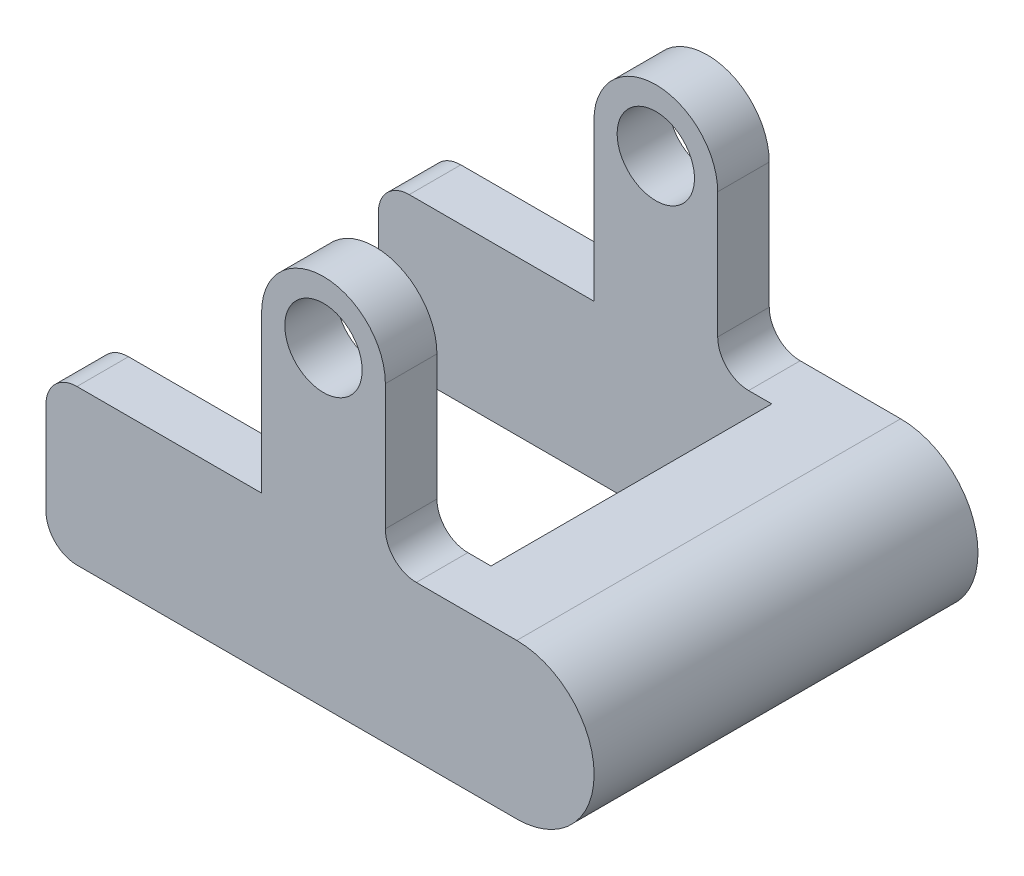
ISO-10303-21;
HEADER;
FILE_DESCRIPTION(('STEP AP214'),'2;1');
FILE_NAME('part.step','',(''),(''),'','','');
FILE_SCHEMA(('AUTOMOTIVE_DESIGN { 1 0 10303 214 1 1 1 1 }'));
ENDSEC;
DATA;
#1=APPLICATION_CONTEXT('core data for automotive mechanical design processes');
#2=APPLICATION_PROTOCOL_DEFINITION('international standard','automotive_design',2000,#1);
#3=PRODUCT_CONTEXT('',#1,'mechanical');
#4=PRODUCT('Part','Part','',(#3));
#5=PRODUCT_RELATED_PRODUCT_CATEGORY('part','',(#4));
#6=PRODUCT_DEFINITION_FORMATION('','',#4);
#7=PRODUCT_DEFINITION_CONTEXT('part definition',#1,'design');
#8=PRODUCT_DEFINITION('design','',#6,#7);
#9=PRODUCT_DEFINITION_SHAPE('','',#8);
#10=(LENGTH_UNIT() NAMED_UNIT(*) SI_UNIT(.MILLI.,.METRE.));
#11=(NAMED_UNIT(*) PLANE_ANGLE_UNIT() SI_UNIT($,.RADIAN.));
#12=(NAMED_UNIT(*) SI_UNIT($,.STERADIAN.) SOLID_ANGLE_UNIT());
#13=UNCERTAINTY_MEASURE_WITH_UNIT(LENGTH_MEASURE(1.E-05),#10,'distance_accuracy_value','');
#14=(GEOMETRIC_REPRESENTATION_CONTEXT(3) GLOBAL_UNCERTAINTY_ASSIGNED_CONTEXT((#13)) GLOBAL_UNIT_ASSIGNED_CONTEXT((#10,
#11,#12)) REPRESENTATION_CONTEXT('',''));
#15=CARTESIAN_POINT('',(0.,0.,0.));
#16=DIRECTION('',(0.,0.,1.));
#17=DIRECTION('',(1.,0.,0.));
#18=AXIS2_PLACEMENT_3D('',#15,#16,#17);
#19=CARTESIAN_POINT('',(-862.5,217.305377859386,25.));
#20=DIRECTION('',(0.,0.,-1.));
#21=DIRECTION('',(-1.,0.,0.));
#22=AXIS2_PLACEMENT_3D('',#19,#20,#21);
#23=CYLINDRICAL_SURFACE('',#22,37.5);
#24=DIRECTION('',(0.,0.,-1.));
#25=VECTOR('',#24,1.);
#26=CARTESIAN_POINT('',(-862.5,254.805377859386,25.));
#27=LINE('',#26,#25);
#28=CARTESIAN_POINT('',(-862.5,254.805377859386,25.));
#29=VERTEX_POINT('',#28);
#30=CARTESIAN_POINT('',(-862.5,254.805377859386,-161.125));
#31=VERTEX_POINT('',#30);
#32=EDGE_CURVE('E284',#29,#31,#27,.T.);
#33=ORIENTED_EDGE('',*,*,#32,.F.);
#34=CARTESIAN_POINT('',(-862.5,217.305377859386,25.));
#35=DIRECTION('',(0.,0.,1.));
#36=DIRECTION('',(1.,0.,0.));
#37=AXIS2_PLACEMENT_3D('',#34,#35,#36);
#38=CIRCLE('',#37,37.5);
#39=CARTESIAN_POINT('',(-862.5,179.805377859386,25.));
#40=VERTEX_POINT('',#39);
#41=EDGE_CURVE('E290',#40,#29,#38,.T.);
#42=ORIENTED_EDGE('',*,*,#41,.F.);
#43=DIRECTION('',(0.,0.,-1.));
#44=VECTOR('',#43,1.);
#45=CARTESIAN_POINT('',(-862.5,179.805377859386,25.));
#46=LINE('',#45,#44);
#47=CARTESIAN_POINT('',(-862.5,179.805377859386,-161.125));
#48=VERTEX_POINT('',#47);
#49=EDGE_CURVE('E287',#48,#40,#46,.F.);
#50=ORIENTED_EDGE('',*,*,#49,.F.);
#51=CARTESIAN_POINT('',(-862.5,217.305377859386,-161.125));
#52=DIRECTION('',(0.,0.,-1.));
#53=DIRECTION('',(-1.,0.,0.));
#54=AXIS2_PLACEMENT_3D('',#51,#52,#53);
#55=CIRCLE('',#54,37.5);
#56=EDGE_CURVE('E293',#31,#48,#55,.T.);
#57=ORIENTED_EDGE('',*,*,#56,.F.);
#58=EDGE_LOOP('',(#33,#42,#50,#57));
#59=FACE_BOUND('',#58,.T.);
#60=ADVANCED_FACE('F36',(#59),#23,.T.);
#61=CARTESIAN_POINT('',(-926.212499999999,0.,25.));
#62=DIRECTION('',(1.,0.,0.));
#63=DIRECTION('',(0.,0.,-1.));
#64=AXIS2_PLACEMENT_3D('',#61,#62,#63);
#65=PLANE('',#64);
#66=DIRECTION('',(0.,-1.,0.));
#67=VECTOR('',#66,1.);
#68=CARTESIAN_POINT('',(-926.212499999999,0.,25.));
#69=LINE('',#68,#67);
#70=CARTESIAN_POINT('',(-926.212499999999,330.750000000002,25.));
#71=VERTEX_POINT('',#70);
#72=CARTESIAN_POINT('',(-926.212499999999,269.805377859386,25.));
#73=VERTEX_POINT('',#72);
#74=EDGE_CURVE('E237',#71,#73,#69,.T.);
#75=ORIENTED_EDGE('',*,*,#74,.T.);
#76=DIRECTION('',(0.,0.,-1.));
#77=VECTOR('',#76,1.);
#78=CARTESIAN_POINT('',(-926.212499999999,269.805377859386,0.));
#79=LINE('',#78,#77);
#80=CARTESIAN_POINT('',(-926.212499999999,269.805377859386,0.));
#81=VERTEX_POINT('',#80);
#82=EDGE_CURVE('E336',#73,#81,#79,.T.);
#83=ORIENTED_EDGE('',*,*,#82,.T.);
#84=DIRECTION('',(0.,-1.,0.));
#85=VECTOR('',#84,1.);
#86=CARTESIAN_POINT('',(-926.212499999999,0.,0.));
#87=LINE('',#86,#85);
#88=CARTESIAN_POINT('',(-926.212499999999,330.750000000002,0.));
#89=VERTEX_POINT('',#88);
#90=EDGE_CURVE('E259',#89,#81,#87,.T.);
#91=ORIENTED_EDGE('',*,*,#90,.F.);
#92=DIRECTION('',(0.,0.,-1.));
#93=VECTOR('',#92,1.);
#94=CARTESIAN_POINT('',(-926.212499999999,330.750000000002,25.));
#95=LINE('',#94,#93);
#96=EDGE_CURVE('E282',#71,#89,#95,.T.);
#97=ORIENTED_EDGE('',*,*,#96,.F.);
#98=EDGE_LOOP('',(#75,#83,#91,#97));
#99=FACE_BOUND('',#98,.T.);
#100=ADVANCED_FACE('F356',(#99),#65,.T.);
#101=CARTESIAN_POINT('',(-956.212499999999,330.750000000002,25.));
#102=DIRECTION('',(0.,0.,-1.));
#103=DIRECTION('',(-1.,0.,0.));
#104=AXIS2_PLACEMENT_3D('',#101,#102,#103);
#105=CYLINDRICAL_SURFACE('',#104,30.0000000000006);
#106=CARTESIAN_POINT('',(-956.212499999999,330.750000000002,0.));
#107=DIRECTION('',(0.,0.,1.));
#108=DIRECTION('',(1.,0.,0.));
#109=AXIS2_PLACEMENT_3D('',#106,#107,#108);
#110=CIRCLE('',#109,30.0000000000006);
#111=CARTESIAN_POINT('',(-986.2125,330.750000000002,0.));
#112=VERTEX_POINT('',#111);
#113=EDGE_CURVE('E262',#89,#112,#110,.T.);
#114=ORIENTED_EDGE('',*,*,#113,.T.);
#115=DIRECTION('',(0.,0.,-1.));
#116=VECTOR('',#115,1.);
#117=CARTESIAN_POINT('',(-986.2125,330.750000000002,25.));
#118=LINE('',#117,#116);
#119=CARTESIAN_POINT('',(-986.2125,330.750000000002,25.));
#120=VERTEX_POINT('',#119);
#121=EDGE_CURVE('E279',#120,#112,#118,.T.);
#122=ORIENTED_EDGE('',*,*,#121,.F.);
#123=CARTESIAN_POINT('',(-956.212499999999,330.750000000002,25.));
#124=DIRECTION('',(0.,0.,1.));
#125=DIRECTION('',(1.,0.,0.));
#126=AXIS2_PLACEMENT_3D('',#123,#124,#125);
#127=CIRCLE('',#126,30.0000000000006);
#128=EDGE_CURVE('E240',#71,#120,#127,.T.);
#129=ORIENTED_EDGE('',*,*,#128,.F.);
#130=ORIENTED_EDGE('',*,*,#96,.T.);
#131=EDGE_LOOP('',(#114,#122,#129,#130));
#132=FACE_BOUND('',#131,.T.);
#133=ADVANCED_FACE('F363',(#132),#105,.T.);
#134=CARTESIAN_POINT('',(-986.2125,0.,25.));
#135=DIRECTION('',(1.,0.,0.));
#136=DIRECTION('',(0.,0.,-1.));
#137=AXIS2_PLACEMENT_3D('',#134,#135,#136);
#138=PLANE('',#137);
#139=DIRECTION('',(0.,-1.,0.));
#140=VECTOR('',#139,1.);
#141=CARTESIAN_POINT('',(-986.2125,0.,0.));
#142=LINE('',#141,#140);
#143=CARTESIAN_POINT('',(-986.2125,254.805377859386,0.));
#144=VERTEX_POINT('',#143);
#145=EDGE_CURVE('E265',#112,#144,#142,.T.);
#146=ORIENTED_EDGE('',*,*,#145,.T.);
#147=DIRECTION('',(0.,0.,-1.));
#148=VECTOR('',#147,1.);
#149=CARTESIAN_POINT('',(-986.2125,254.805377859386,25.));
#150=LINE('',#149,#148);
#151=CARTESIAN_POINT('',(-986.2125,254.805377859386,25.));
#152=VERTEX_POINT('',#151);
#153=EDGE_CURVE('E256',#152,#144,#150,.T.);
#154=ORIENTED_EDGE('',*,*,#153,.F.);
#155=DIRECTION('',(0.,-1.,0.));
#156=VECTOR('',#155,1.);
#157=CARTESIAN_POINT('',(-986.2125,0.,25.));
#158=LINE('',#157,#156);
#159=EDGE_CURVE('E243',#120,#152,#158,.T.);
#160=ORIENTED_EDGE('',*,*,#159,.F.);
#161=ORIENTED_EDGE('',*,*,#121,.T.);
#162=EDGE_LOOP('',(#146,#154,#160,#161));
#163=FACE_BOUND('',#162,.T.);
#164=ADVANCED_FACE('F365',(#163),#138,.F.);
#165=CARTESIAN_POINT('',(-1.35305893721298E-13,254.805377859387,25.));
#166=DIRECTION('',(0.,-1.,0.));
#167=DIRECTION('',(1.,0.,0.));
#168=AXIS2_PLACEMENT_3D('',#165,#166,#167);
#169=PLANE('',#168);
#170=DIRECTION('',(-1.,0.,0.));
#171=VECTOR('',#170,1.);
#172=CARTESIAN_POINT('',(-1.35305893721298E-13,254.805377859387,0.));
#173=LINE('',#172,#171);
#174=CARTESIAN_POINT('',(-1075.75,254.805377859386,0.));
#175=VERTEX_POINT('',#174);
#176=EDGE_CURVE('E268',#144,#175,#173,.T.);
#177=ORIENTED_EDGE('',*,*,#176,.T.);
#178=DIRECTION('',(0.,0.,-1.));
#179=VECTOR('',#178,1.);
#180=CARTESIAN_POINT('',(-1075.75,254.805377859386,25.));
#181=LINE('',#180,#179);
#182=CARTESIAN_POINT('',(-1075.75,254.805377859386,25.));
#183=VERTEX_POINT('',#182);
#184=EDGE_CURVE('E51',#175,#183,#181,.F.);
#185=ORIENTED_EDGE('',*,*,#184,.T.);
#186=DIRECTION('',(-1.,0.,0.));
#187=VECTOR('',#186,1.);
#188=CARTESIAN_POINT('',(-1.35305893721298E-13,254.805377859387,25.));
#189=LINE('',#188,#187);
#190=EDGE_CURVE('E246',#152,#183,#189,.T.);
#191=ORIENTED_EDGE('',*,*,#190,.F.);
#192=ORIENTED_EDGE('',*,*,#153,.T.);
#193=EDGE_LOOP('',(#177,#185,#191,#192));
#194=FACE_BOUND('',#193,.T.);
#195=ADVANCED_FACE('F366',(#194),#169,.F.);
#196=CARTESIAN_POINT('',(-1090.75,3.22926870429304E-12,25.));
#197=DIRECTION('',(-1.,0.,0.));
#198=DIRECTION('',(0.,-1.,0.));
#199=AXIS2_PLACEMENT_3D('',#196,#197,#198);
#200=PLANE('',#199);
#201=DIRECTION('',(0.,1.,0.));
#202=VECTOR('',#201,1.);
#203=CARTESIAN_POINT('',(-1090.75,3.22926870429304E-12,0.));
#204=LINE('',#203,#202);
#205=CARTESIAN_POINT('',(-1090.75,194.805377859386,0.));
#206=VERTEX_POINT('',#205);
#207=CARTESIAN_POINT('',(-1090.75,239.805377859386,0.));
#208=VERTEX_POINT('',#207);
#209=EDGE_CURVE('E270',#206,#208,#204,.T.);
#210=ORIENTED_EDGE('',*,*,#209,.F.);
#211=DIRECTION('',(0.,0.,-1.));
#212=VECTOR('',#211,1.);
#213=CARTESIAN_POINT('',(-1090.75,194.805377859386,25.));
#214=LINE('',#213,#212);
#215=CARTESIAN_POINT('',(-1090.75,194.805377859386,25.));
#216=VERTEX_POINT('',#215);
#217=EDGE_CURVE('E323',#206,#216,#214,.F.);
#218=ORIENTED_EDGE('',*,*,#217,.T.);
#219=DIRECTION('',(0.,1.,0.));
#220=VECTOR('',#219,1.);
#221=CARTESIAN_POINT('',(-1090.75,3.22926870429304E-12,25.));
#222=LINE('',#221,#220);
#223=CARTESIAN_POINT('',(-1090.75,239.805377859386,25.));
#224=VERTEX_POINT('',#223);
#225=EDGE_CURVE('E248',#216,#224,#222,.T.);
#226=ORIENTED_EDGE('',*,*,#225,.T.);
#227=DIRECTION('',(0.,0.,-1.));
#228=VECTOR('',#227,1.);
#229=CARTESIAN_POINT('',(-1090.75,239.805377859386,0.));
#230=LINE('',#229,#228);
#231=EDGE_CURVE('E320',#224,#208,#230,.T.);
#232=ORIENTED_EDGE('',*,*,#231,.T.);
#233=EDGE_LOOP('',(#210,#218,#226,#232));
#234=FACE_BOUND('',#233,.T.);
#235=ADVANCED_FACE('F373',(#234),#200,.T.);
#236=CARTESIAN_POINT('',(0.,179.805377859386,25.));
#237=DIRECTION('',(0.,-1.,0.));
#238=DIRECTION('',(0.,0.,-1.));
#239=AXIS2_PLACEMENT_3D('',#236,#237,#238);
#240=PLANE('',#239);
#241=DIRECTION('',(-1.,0.,0.));
#242=VECTOR('',#241,1.);
#243=CARTESIAN_POINT('',(-825.,179.805377859386,-136.125));
#244=LINE('',#243,#242);
#245=CARTESIAN_POINT('',(-900.,179.805377859386,-136.125));
#246=VERTEX_POINT('',#245);
#247=CARTESIAN_POINT('',(-1075.75,179.805377859386,-136.125));
#248=VERTEX_POINT('',#247);
#249=EDGE_CURVE('E403',#246,#248,#244,.T.);
#250=ORIENTED_EDGE('',*,*,#249,.T.);
#251=DIRECTION('',(0.,0.,1.));
#252=VECTOR('',#251,1.);
#253=CARTESIAN_POINT('',(-1075.75,179.805377859386,-161.125));
#254=LINE('',#253,#252);
#255=CARTESIAN_POINT('',(-1075.75,179.805377859386,-161.125));
#256=VERTEX_POINT('',#255);
#257=EDGE_CURVE('E314',#248,#256,#254,.F.);
#258=ORIENTED_EDGE('',*,*,#257,.T.);
#259=DIRECTION('',(-1.,0.,0.));
#260=VECTOR('',#259,1.);
#261=CARTESIAN_POINT('',(-825.,179.805377859386,-161.125));
#262=LINE('',#261,#260);
#263=EDGE_CURVE('E391',#48,#256,#262,.T.);
#264=ORIENTED_EDGE('',*,*,#263,.F.);
#265=ORIENTED_EDGE('',*,*,#49,.T.);
#266=DIRECTION('',(-1.,0.,0.));
#267=VECTOR('',#266,1.);
#268=CARTESIAN_POINT('',(0.,179.805377859386,25.));
#269=LINE('',#268,#267);
#270=CARTESIAN_POINT('',(-1075.75,179.805377859386,25.));
#271=VERTEX_POINT('',#270);
#272=EDGE_CURVE('E251',#40,#271,#269,.T.);
#273=ORIENTED_EDGE('',*,*,#272,.T.);
#274=DIRECTION('',(0.,0.,-1.));
#275=VECTOR('',#274,1.);
#276=CARTESIAN_POINT('',(-1075.75,179.805377859386,25.));
#277=LINE('',#276,#275);
#278=CARTESIAN_POINT('',(-1075.75,179.805377859386,0.));
#279=VERTEX_POINT('',#278);
#280=EDGE_CURVE('E311',#271,#279,#277,.T.);
#281=ORIENTED_EDGE('',*,*,#280,.T.);
#282=DIRECTION('',(-1.,0.,0.));
#283=VECTOR('',#282,1.);
#284=CARTESIAN_POINT('',(0.,179.805377859386,0.));
#285=LINE('',#284,#283);
#286=CARTESIAN_POINT('',(-900.,179.805377859386,0.));
#287=VERTEX_POINT('',#286);
#288=EDGE_CURVE('E273',#287,#279,#285,.T.);
#289=ORIENTED_EDGE('',*,*,#288,.F.);
#290=DIRECTION('',(0.,0.,-1.));
#291=VECTOR('',#290,1.);
#292=CARTESIAN_POINT('',(-900.,179.805377859386,106.066017177982));
#293=LINE('',#292,#291);
#294=EDGE_CURVE('E227',#287,#246,#293,.T.);
#295=ORIENTED_EDGE('',*,*,#294,.T.);
#296=EDGE_LOOP('',(#250,#258,#264,#265,#273,#281,#289,#295));
#297=FACE_BOUND('',#296,.T.);
#298=ADVANCED_FACE('F382',(#297),#240,.T.);
#299=CARTESIAN_POINT('',(-956.212499999999,330.750000000002,25.));
#300=DIRECTION('',(0.,0.,-1.));
#301=DIRECTION('',(-1.,0.,0.));
#302=AXIS2_PLACEMENT_3D('',#299,#300,#301);
#303=CYLINDRICAL_SURFACE('',#302,18.7499999999999);
#304=CARTESIAN_POINT('',(-956.212499999999,330.750000000002,25.));
#305=DIRECTION('',(0.,0.,1.));
#306=DIRECTION('',(1.,0.,0.));
#307=AXIS2_PLACEMENT_3D('',#304,#305,#306);
#308=CIRCLE('',#307,18.7499999999999);
#309=CARTESIAN_POINT('',(-937.4625,330.750000000002,25.));
#310=VERTEX_POINT('',#309);
#311=EDGE_CURVE('E234',#310,#310,#308,.T.);
#312=ORIENTED_EDGE('',*,*,#311,.T.);
#313=EDGE_LOOP('',(#312));
#314=FACE_BOUND('',#313,.T.);
#315=CARTESIAN_POINT('',(-956.212499999999,330.750000000002,0.));
#316=DIRECTION('',(0.,0.,1.));
#317=DIRECTION('',(1.,0.,0.));
#318=AXIS2_PLACEMENT_3D('',#315,#316,#317);
#319=CIRCLE('',#318,18.7499999999999);
#320=CARTESIAN_POINT('',(-937.4625,330.750000000002,0.));
#321=VERTEX_POINT('',#320);
#322=EDGE_CURVE('E230',#321,#321,#319,.T.);
#323=ORIENTED_EDGE('',*,*,#322,.F.);
#324=EDGE_LOOP('',(#323));
#325=FACE_BOUND('',#324,.T.);
#326=ADVANCED_FACE('F452',(#314,#325),#303,.F.);
#327=CARTESIAN_POINT('',(0.,254.805377859386,25.));
#328=DIRECTION('',(0.,1.,0.));
#329=DIRECTION('',(0.,0.,1.));
#330=AXIS2_PLACEMENT_3D('',#327,#328,#329);
#331=PLANE('',#330);
#332=DIRECTION('',(1.,0.,0.));
#333=VECTOR('',#332,1.);
#334=CARTESIAN_POINT('',(-926.212499999999,254.805377859386,-161.125));
#335=LINE('',#334,#333);
#336=CARTESIAN_POINT('',(-911.212499999999,254.805377859386,-161.125));
#337=VERTEX_POINT('',#336);
#338=EDGE_CURVE('E197',#337,#31,#335,.T.);
#339=ORIENTED_EDGE('',*,*,#338,.F.);
#340=DIRECTION('',(0.,0.,1.));
#341=VECTOR('',#340,1.);
#342=CARTESIAN_POINT('',(-911.212499999999,254.805377859386,25.));
#343=LINE('',#342,#341);
#344=CARTESIAN_POINT('',(-911.212499999999,254.805377859386,-136.125));
#345=VERTEX_POINT('',#344);
#346=EDGE_CURVE('E332',#337,#345,#343,.T.);
#347=ORIENTED_EDGE('',*,*,#346,.T.);
#348=DIRECTION('',(1.,0.,0.));
#349=VECTOR('',#348,1.);
#350=CARTESIAN_POINT('',(-926.212499999999,254.805377859386,-136.125));
#351=LINE('',#350,#349);
#352=CARTESIAN_POINT('',(-900.,254.805377859386,-136.125));
#353=VERTEX_POINT('',#352);
#354=EDGE_CURVE('E401',#345,#353,#351,.T.);
#355=ORIENTED_EDGE('',*,*,#354,.T.);
#356=DIRECTION('',(0.,0.,-1.));
#357=VECTOR('',#356,1.);
#358=CARTESIAN_POINT('',(-900.,254.805377859386,106.066017177982));
#359=LINE('',#358,#357);
#360=CARTESIAN_POINT('',(-900.,254.805377859386,0.));
#361=VERTEX_POINT('',#360);
#362=EDGE_CURVE('E214',#361,#353,#359,.T.);
#363=ORIENTED_EDGE('',*,*,#362,.F.);
#364=DIRECTION('',(1.,0.,0.));
#365=VECTOR('',#364,1.);
#366=CARTESIAN_POINT('',(0.,254.805377859386,0.));
#367=LINE('',#366,#365);
#368=CARTESIAN_POINT('',(-911.212499999999,254.805377859386,0.));
#369=VERTEX_POINT('',#368);
#370=EDGE_CURVE('E238',#369,#361,#367,.T.);
#371=ORIENTED_EDGE('',*,*,#370,.F.);
#372=DIRECTION('',(0.,0.,-1.));
#373=VECTOR('',#372,1.);
#374=CARTESIAN_POINT('',(-911.212499999999,254.805377859386,25.));
#375=LINE('',#374,#373);
#376=CARTESIAN_POINT('',(-911.212499999999,254.805377859386,25.));
#377=VERTEX_POINT('',#376);
#378=EDGE_CURVE('E330',#369,#377,#375,.F.);
#379=ORIENTED_EDGE('',*,*,#378,.T.);
#380=DIRECTION('',(1.,0.,0.));
#381=VECTOR('',#380,1.);
#382=CARTESIAN_POINT('',(0.,254.805377859386,25.));
#383=LINE('',#382,#381);
#384=EDGE_CURVE('E254',#377,#29,#383,.T.);
#385=ORIENTED_EDGE('',*,*,#384,.T.);
#386=ORIENTED_EDGE('',*,*,#32,.T.);
#387=EDGE_LOOP('',(#339,#347,#355,#363,#371,#379,#385,#386));
#388=FACE_BOUND('',#387,.T.);
#389=ADVANCED_FACE('F354',(#388),#331,.T.);
#390=CARTESIAN_POINT('',(0.,0.,25.));
#391=DIRECTION('',(0.,0.,1.));
#392=DIRECTION('',(1.,0.,0.));
#393=AXIS2_PLACEMENT_3D('',#390,#391,#392);
#394=PLANE('',#393);
#395=ORIENTED_EDGE('',*,*,#311,.F.);
#396=EDGE_LOOP('',(#395));
#397=FACE_BOUND('',#396,.T.);
#398=ORIENTED_EDGE('',*,*,#225,.F.);
#399=CARTESIAN_POINT('',(-1075.75,194.805377859386,25.));
#400=DIRECTION('',(0.,0.,1.));
#401=DIRECTION('',(1.,0.,0.));
#402=AXIS2_PLACEMENT_3D('',#399,#400,#401);
#403=CIRCLE('',#402,15.);
#404=EDGE_CURVE('E327',#216,#271,#403,.T.);
#405=ORIENTED_EDGE('',*,*,#404,.T.);
#406=ORIENTED_EDGE('',*,*,#272,.F.);
#407=ORIENTED_EDGE('',*,*,#41,.T.);
#408=ORIENTED_EDGE('',*,*,#384,.F.);
#409=CARTESIAN_POINT('',(-911.212499999999,269.805377859386,25.));
#410=DIRECTION('',(0.,0.,1.));
#411=DIRECTION('',(1.,0.,0.));
#412=AXIS2_PLACEMENT_3D('',#409,#410,#411);
#413=CIRCLE('',#412,15.);
#414=EDGE_CURVE('E11',#377,#73,#413,.F.);
#415=ORIENTED_EDGE('',*,*,#414,.T.);
#416=ORIENTED_EDGE('',*,*,#74,.F.);
#417=ORIENTED_EDGE('',*,*,#128,.T.);
#418=ORIENTED_EDGE('',*,*,#159,.T.);
#419=ORIENTED_EDGE('',*,*,#190,.T.);
#420=CARTESIAN_POINT('',(-1075.75,239.805377859386,25.));
#421=DIRECTION('',(0.,0.,1.));
#422=DIRECTION('',(1.,0.,0.));
#423=AXIS2_PLACEMENT_3D('',#420,#421,#422);
#424=CIRCLE('',#423,15.);
#425=EDGE_CURVE('E325',#183,#224,#424,.T.);
#426=ORIENTED_EDGE('',*,*,#425,.T.);
#427=EDGE_LOOP('',(#398,#405,#406,#407,#408,#415,#416,#417,#418,#419,#426));
#428=FACE_BOUND('',#427,.T.);
#429=ADVANCED_FACE('F359',(#397,#428),#394,.T.);
#430=CARTESIAN_POINT('',(0.,0.,0.));
#431=DIRECTION('',(0.,0.,1.));
#432=DIRECTION('',(1.,0.,0.));
#433=AXIS2_PLACEMENT_3D('',#430,#431,#432);
#434=PLANE('',#433);
#435=ORIENTED_EDGE('',*,*,#322,.T.);
#436=EDGE_LOOP('',(#435));
#437=FACE_BOUND('',#436,.T.);
#438=ORIENTED_EDGE('',*,*,#288,.T.);
#439=CARTESIAN_POINT('',(-1075.75,194.805377859386,0.));
#440=DIRECTION('',(0.,0.,1.));
#441=DIRECTION('',(1.,0.,0.));
#442=AXIS2_PLACEMENT_3D('',#439,#440,#441);
#443=CIRCLE('',#442,15.);
#444=EDGE_CURVE('E318',#279,#206,#443,.F.);
#445=ORIENTED_EDGE('',*,*,#444,.T.);
#446=ORIENTED_EDGE('',*,*,#209,.T.);
#447=CARTESIAN_POINT('',(-1075.75,239.805377859386,0.));
#448=DIRECTION('',(0.,0.,1.));
#449=DIRECTION('',(1.,0.,0.));
#450=AXIS2_PLACEMENT_3D('',#447,#448,#449);
#451=CIRCLE('',#450,15.);
#452=EDGE_CURVE('E316',#208,#175,#451,.F.);
#453=ORIENTED_EDGE('',*,*,#452,.T.);
#454=ORIENTED_EDGE('',*,*,#176,.F.);
#455=ORIENTED_EDGE('',*,*,#145,.F.);
#456=ORIENTED_EDGE('',*,*,#113,.F.);
#457=ORIENTED_EDGE('',*,*,#90,.T.);
#458=CARTESIAN_POINT('',(-911.212499999999,269.805377859386,0.));
#459=DIRECTION('',(0.,0.,1.));
#460=DIRECTION('',(1.,0.,0.));
#461=AXIS2_PLACEMENT_3D('',#458,#459,#460);
#462=CIRCLE('',#461,15.);
#463=EDGE_CURVE('E44',#81,#369,#462,.T.);
#464=ORIENTED_EDGE('',*,*,#463,.T.);
#465=ORIENTED_EDGE('',*,*,#370,.T.);
#466=DIRECTION('',(0.,-1.,0.));
#467=VECTOR('',#466,1.);
#468=CARTESIAN_POINT('',(-900.,179.805377859386,0.));
#469=LINE('',#468,#467);
#470=EDGE_CURVE('E228',#361,#287,#469,.T.);
#471=ORIENTED_EDGE('',*,*,#470,.T.);
#472=EDGE_LOOP('',(#438,#445,#446,#453,#454,#455,#456,#457,#464,#465,#471));
#473=FACE_BOUND('',#472,.T.);
#474=ADVANCED_FACE('F344',(#437,#473),#434,.F.);
#475=CARTESIAN_POINT('',(-900.,179.805377859386,106.066017177982));
#476=DIRECTION('',(1.,0.,0.));
#477=DIRECTION('',(0.,0.,-1.));
#478=AXIS2_PLACEMENT_3D('',#475,#476,#477);
#479=PLANE('',#478);
#480=ORIENTED_EDGE('',*,*,#470,.F.);
#481=ORIENTED_EDGE('',*,*,#362,.T.);
#482=DIRECTION('',(0.,-1.,0.));
#483=VECTOR('',#482,1.);
#484=CARTESIAN_POINT('',(-900.,179.805377859386,-136.125));
#485=LINE('',#484,#483);
#486=EDGE_CURVE('E218',#353,#246,#485,.T.);
#487=ORIENTED_EDGE('',*,*,#486,.T.);
#488=ORIENTED_EDGE('',*,*,#294,.F.);
#489=EDGE_LOOP('',(#480,#481,#487,#488));
#490=FACE_BOUND('',#489,.T.);
#491=ADVANCED_FACE('F431',(#490),#479,.F.);
#492=CARTESIAN_POINT('',(-956.212499999999,330.750000000002,-161.125));
#493=DIRECTION('',(0.,0.,-1.));
#494=DIRECTION('',(-1.,0.,0.));
#495=AXIS2_PLACEMENT_3D('',#492,#493,#494);
#496=PLANE('',#495);
#497=DIRECTION('',(0.,1.,0.));
#498=VECTOR('',#497,1.);
#499=CARTESIAN_POINT('',(-1090.75,179.805377859386,-161.125));
#500=LINE('',#499,#498);
#501=CARTESIAN_POINT('',(-1090.75,194.805377859386,-161.125));
#502=VERTEX_POINT('',#501);
#503=CARTESIAN_POINT('',(-1090.75,239.805377859386,-161.125));
#504=VERTEX_POINT('',#503);
#505=EDGE_CURVE('E416',#502,#504,#500,.T.);
#506=ORIENTED_EDGE('',*,*,#505,.T.);
#507=CARTESIAN_POINT('',(-1075.75,239.805377859386,-161.125));
#508=DIRECTION('',(0.,0.,-1.));
#509=DIRECTION('',(-1.,0.,0.));
#510=AXIS2_PLACEMENT_3D('',#507,#508,#509);
#511=CIRCLE('',#510,15.);
#512=CARTESIAN_POINT('',(-1075.75,254.805377859386,-161.125));
#513=VERTEX_POINT('',#512);
#514=EDGE_CURVE('E309',#504,#513,#511,.T.);
#515=ORIENTED_EDGE('',*,*,#514,.T.);
#516=DIRECTION('',(1.,0.,0.));
#517=VECTOR('',#516,1.);
#518=CARTESIAN_POINT('',(-1090.75,254.805377859386,-161.125));
#519=LINE('',#518,#517);
#520=CARTESIAN_POINT('',(-986.2125,254.805377859386,-161.125));
#521=VERTEX_POINT('',#520);
#522=EDGE_CURVE('E415',#513,#521,#519,.T.);
#523=ORIENTED_EDGE('',*,*,#522,.T.);
#524=DIRECTION('',(0.,1.,0.));
#525=VECTOR('',#524,1.);
#526=CARTESIAN_POINT('',(-986.2125,254.805377859386,-161.125));
#527=LINE('',#526,#525);
#528=CARTESIAN_POINT('',(-986.2125,330.750000000002,-161.125));
#529=VERTEX_POINT('',#528);
#530=EDGE_CURVE('E205',#521,#529,#527,.T.);
#531=ORIENTED_EDGE('',*,*,#530,.T.);
#532=CARTESIAN_POINT('',(-956.212499999999,330.750000000002,-161.125));
#533=DIRECTION('',(0.,0.,-1.));
#534=DIRECTION('',(-1.,0.,0.));
#535=AXIS2_PLACEMENT_3D('',#532,#533,#534);
#536=CIRCLE('',#535,30.0000000000006);
#537=CARTESIAN_POINT('',(-926.212499999999,330.750000000002,-161.125));
#538=VERTEX_POINT('',#537);
#539=EDGE_CURVE('E198',#529,#538,#536,.T.);
#540=ORIENTED_EDGE('',*,*,#539,.T.);
#541=DIRECTION('',(0.,-1.,0.));
#542=VECTOR('',#541,1.);
#543=CARTESIAN_POINT('',(-926.212499999999,330.750000000002,-161.125));
#544=LINE('',#543,#542);
#545=CARTESIAN_POINT('',(-926.212499999999,269.805377859386,-161.125));
#546=VERTEX_POINT('',#545);
#547=EDGE_CURVE('E186',#538,#546,#544,.T.);
#548=ORIENTED_EDGE('',*,*,#547,.T.);
#549=CARTESIAN_POINT('',(-911.212499999999,269.805377859386,-161.125));
#550=DIRECTION('',(0.,0.,-1.));
#551=DIRECTION('',(-1.,0.,0.));
#552=AXIS2_PLACEMENT_3D('',#549,#550,#551);
#553=CIRCLE('',#552,15.);
#554=EDGE_CURVE('E341',#546,#337,#553,.F.);
#555=ORIENTED_EDGE('',*,*,#554,.T.);
#556=ORIENTED_EDGE('',*,*,#338,.T.);
#557=ORIENTED_EDGE('',*,*,#56,.T.);
#558=ORIENTED_EDGE('',*,*,#263,.T.);
#559=CARTESIAN_POINT('',(-1075.75,194.805377859386,-161.125));
#560=DIRECTION('',(0.,0.,-1.));
#561=DIRECTION('',(-1.,0.,0.));
#562=AXIS2_PLACEMENT_3D('',#559,#560,#561);
#563=CIRCLE('',#562,15.);
#564=EDGE_CURVE('E307',#256,#502,#563,.T.);
#565=ORIENTED_EDGE('',*,*,#564,.T.);
#566=EDGE_LOOP('',(#506,#515,#523,#531,#540,#548,#555,#556,#557,#558,#565));
#567=FACE_BOUND('',#566,.T.);
#568=CARTESIAN_POINT('',(-956.212499999999,330.750000000002,-161.125));
#569=DIRECTION('',(0.,0.,-1.));
#570=DIRECTION('',(-1.,0.,0.));
#571=AXIS2_PLACEMENT_3D('',#568,#569,#570);
#572=CIRCLE('',#571,18.7499999999999);
#573=CARTESIAN_POINT('',(-974.962499999999,330.750000000002,-161.125));
#574=VERTEX_POINT('',#573);
#575=EDGE_CURVE('E405',#574,#574,#572,.T.);
#576=ORIENTED_EDGE('',*,*,#575,.F.);
#577=EDGE_LOOP('',(#576));
#578=FACE_BOUND('',#577,.T.);
#579=ADVANCED_FACE('F202',(#567,#578),#496,.T.);
#580=CARTESIAN_POINT('',(-956.212499999999,330.750000000002,-136.125));
#581=DIRECTION('',(0.,0.,-1.));
#582=DIRECTION('',(-1.,0.,0.));
#583=AXIS2_PLACEMENT_3D('',#580,#581,#582);
#584=PLANE('',#583);
#585=DIRECTION('',(1.,0.,0.));
#586=VECTOR('',#585,1.);
#587=CARTESIAN_POINT('',(-1090.75,254.805377859386,-136.125));
#588=LINE('',#587,#586);
#589=CARTESIAN_POINT('',(-1075.75,254.805377859386,-136.125));
#590=VERTEX_POINT('',#589);
#591=CARTESIAN_POINT('',(-986.2125,254.805377859386,-136.125));
#592=VERTEX_POINT('',#591);
#593=EDGE_CURVE('E413',#590,#592,#588,.T.);
#594=ORIENTED_EDGE('',*,*,#593,.F.);
#595=CARTESIAN_POINT('',(-1075.75,239.805377859386,-136.125));
#596=DIRECTION('',(0.,0.,-1.));
#597=DIRECTION('',(-1.,0.,0.));
#598=AXIS2_PLACEMENT_3D('',#595,#596,#597);
#599=CIRCLE('',#598,15.);
#600=CARTESIAN_POINT('',(-1090.75,239.805377859386,-136.125));
#601=VERTEX_POINT('',#600);
#602=EDGE_CURVE('E300',#590,#601,#599,.F.);
#603=ORIENTED_EDGE('',*,*,#602,.T.);
#604=DIRECTION('',(0.,1.,0.));
#605=VECTOR('',#604,1.);
#606=CARTESIAN_POINT('',(-1090.75,179.805377859386,-136.125));
#607=LINE('',#606,#605);
#608=CARTESIAN_POINT('',(-1090.75,194.805377859386,-136.125));
#609=VERTEX_POINT('',#608);
#610=EDGE_CURVE('E410',#609,#601,#607,.T.);
#611=ORIENTED_EDGE('',*,*,#610,.F.);
#612=CARTESIAN_POINT('',(-1075.75,194.805377859386,-136.125));
#613=DIRECTION('',(0.,0.,-1.));
#614=DIRECTION('',(-1.,0.,0.));
#615=AXIS2_PLACEMENT_3D('',#612,#613,#614);
#616=CIRCLE('',#615,15.);
#617=EDGE_CURVE('E298',#609,#248,#616,.F.);
#618=ORIENTED_EDGE('',*,*,#617,.T.);
#619=ORIENTED_EDGE('',*,*,#249,.F.);
#620=ORIENTED_EDGE('',*,*,#486,.F.);
#621=ORIENTED_EDGE('',*,*,#354,.F.);
#622=CARTESIAN_POINT('',(-911.212499999999,269.805377859386,-136.125));
#623=DIRECTION('',(0.,0.,-1.));
#624=DIRECTION('',(-1.,0.,0.));
#625=AXIS2_PLACEMENT_3D('',#622,#623,#624);
#626=CIRCLE('',#625,15.);
#627=CARTESIAN_POINT('',(-926.212499999999,269.805377859386,-136.125));
#628=VERTEX_POINT('',#627);
#629=EDGE_CURVE('E339',#345,#628,#626,.T.);
#630=ORIENTED_EDGE('',*,*,#629,.T.);
#631=DIRECTION('',(0.,-1.,0.));
#632=VECTOR('',#631,1.);
#633=CARTESIAN_POINT('',(-926.212499999999,330.750000000002,-136.125));
#634=LINE('',#633,#632);
#635=CARTESIAN_POINT('',(-926.212499999999,330.750000000002,-136.125));
#636=VERTEX_POINT('',#635);
#637=EDGE_CURVE('E399',#636,#628,#634,.T.);
#638=ORIENTED_EDGE('',*,*,#637,.F.);
#639=CARTESIAN_POINT('',(-956.212499999999,330.750000000002,-136.125));
#640=DIRECTION('',(0.,0.,-1.));
#641=DIRECTION('',(-1.,0.,0.));
#642=AXIS2_PLACEMENT_3D('',#639,#640,#641);
#643=CIRCLE('',#642,30.0000000000006);
#644=CARTESIAN_POINT('',(-986.2125,330.750000000002,-136.125));
#645=VERTEX_POINT('',#644);
#646=EDGE_CURVE('E213',#645,#636,#643,.T.);
#647=ORIENTED_EDGE('',*,*,#646,.F.);
#648=DIRECTION('',(0.,1.,0.));
#649=VECTOR('',#648,1.);
#650=CARTESIAN_POINT('',(-986.2125,254.805377859386,-136.125));
#651=LINE('',#650,#649);
#652=EDGE_CURVE('E209',#592,#645,#651,.T.);
#653=ORIENTED_EDGE('',*,*,#652,.F.);
#654=EDGE_LOOP('',(#594,#603,#611,#618,#619,#620,#621,#630,#638,#647,#653));
#655=FACE_BOUND('',#654,.T.);
#656=CARTESIAN_POINT('',(-956.212499999999,330.750000000002,-136.125));
#657=DIRECTION('',(0.,0.,-1.));
#658=DIRECTION('',(-1.,0.,0.));
#659=AXIS2_PLACEMENT_3D('',#656,#657,#658);
#660=CIRCLE('',#659,18.7499999999999);
#661=CARTESIAN_POINT('',(-974.962499999999,330.750000000002,-136.125));
#662=VERTEX_POINT('',#661);
#663=EDGE_CURVE('E422',#662,#662,#660,.T.);
#664=ORIENTED_EDGE('',*,*,#663,.T.);
#665=EDGE_LOOP('',(#664));
#666=FACE_BOUND('',#665,.T.);
#667=ADVANCED_FACE('F397',(#655,#666),#584,.F.);
#668=CARTESIAN_POINT('',(-956.212499999999,330.750000000002,-161.125));
#669=DIRECTION('',(0.,0.,1.));
#670=DIRECTION('',(1.,0.,0.));
#671=AXIS2_PLACEMENT_3D('',#668,#669,#670);
#672=CYLINDRICAL_SURFACE('',#671,30.0000000000006);
#673=ORIENTED_EDGE('',*,*,#646,.T.);
#674=DIRECTION('',(0.,0.,1.));
#675=VECTOR('',#674,1.);
#676=CARTESIAN_POINT('',(-926.212499999999,330.750000000002,-161.125));
#677=LINE('',#676,#675);
#678=EDGE_CURVE('E191',#538,#636,#677,.T.);
#679=ORIENTED_EDGE('',*,*,#678,.F.);
#680=ORIENTED_EDGE('',*,*,#539,.F.);
#681=DIRECTION('',(0.,0.,1.));
#682=VECTOR('',#681,1.);
#683=CARTESIAN_POINT('',(-986.2125,330.750000000002,-161.125));
#684=LINE('',#683,#682);
#685=EDGE_CURVE('E221',#529,#645,#684,.T.);
#686=ORIENTED_EDGE('',*,*,#685,.T.);
#687=EDGE_LOOP('',(#673,#679,#680,#686));
#688=FACE_BOUND('',#687,.T.);
#689=ADVANCED_FACE('F211',(#688),#672,.T.);
#690=CARTESIAN_POINT('',(-926.212499999999,330.750000000002,-161.125));
#691=DIRECTION('',(-1.,0.,0.));
#692=DIRECTION('',(0.,0.,1.));
#693=AXIS2_PLACEMENT_3D('',#690,#691,#692);
#694=PLANE('',#693);
#695=ORIENTED_EDGE('',*,*,#637,.T.);
#696=DIRECTION('',(0.,0.,1.));
#697=VECTOR('',#696,1.);
#698=CARTESIAN_POINT('',(-926.212499999999,269.805377859386,-161.125));
#699=LINE('',#698,#697);
#700=EDGE_CURVE('E194',#628,#546,#699,.F.);
#701=ORIENTED_EDGE('',*,*,#700,.T.);
#702=ORIENTED_EDGE('',*,*,#547,.F.);
#703=ORIENTED_EDGE('',*,*,#678,.T.);
#704=EDGE_LOOP('',(#695,#701,#702,#703));
#705=FACE_BOUND('',#704,.T.);
#706=ADVANCED_FACE('F189',(#705),#694,.F.);
#707=CARTESIAN_POINT('',(-1090.75,179.805377859386,-161.125));
#708=DIRECTION('',(1.,0.,0.));
#709=DIRECTION('',(0.,1.,0.));
#710=AXIS2_PLACEMENT_3D('',#707,#708,#709);
#711=PLANE('',#710);
#712=ORIENTED_EDGE('',*,*,#610,.T.);
#713=DIRECTION('',(0.,0.,1.));
#714=VECTOR('',#713,1.);
#715=CARTESIAN_POINT('',(-1090.75,239.805377859386,-161.125));
#716=LINE('',#715,#714);
#717=EDGE_CURVE('E305',#601,#504,#716,.F.);
#718=ORIENTED_EDGE('',*,*,#717,.T.);
#719=ORIENTED_EDGE('',*,*,#505,.F.);
#720=DIRECTION('',(0.,0.,1.));
#721=VECTOR('',#720,1.);
#722=CARTESIAN_POINT('',(-1090.75,194.805377859386,-136.125));
#723=LINE('',#722,#721);
#724=EDGE_CURVE('E302',#502,#609,#723,.T.);
#725=ORIENTED_EDGE('',*,*,#724,.T.);
#726=EDGE_LOOP('',(#712,#718,#719,#725));
#727=FACE_BOUND('',#726,.T.);
#728=ADVANCED_FACE('F511',(#727),#711,.F.);
#729=CARTESIAN_POINT('',(-1090.75,254.805377859386,-161.125));
#730=DIRECTION('',(0.,-1.,0.));
#731=DIRECTION('',(1.,0.,0.));
#732=AXIS2_PLACEMENT_3D('',#729,#730,#731);
#733=PLANE('',#732);
#734=ORIENTED_EDGE('',*,*,#522,.F.);
#735=DIRECTION('',(0.,0.,1.));
#736=VECTOR('',#735,1.);
#737=CARTESIAN_POINT('',(-1075.75,254.805377859386,-161.125));
#738=LINE('',#737,#736);
#739=EDGE_CURVE('E295',#513,#590,#738,.T.);
#740=ORIENTED_EDGE('',*,*,#739,.T.);
#741=ORIENTED_EDGE('',*,*,#593,.T.);
#742=DIRECTION('',(0.,0.,1.));
#743=VECTOR('',#742,1.);
#744=CARTESIAN_POINT('',(-986.2125,254.805377859386,-161.125));
#745=LINE('',#744,#743);
#746=EDGE_CURVE('E215',#521,#592,#745,.T.);
#747=ORIENTED_EDGE('',*,*,#746,.F.);
#748=EDGE_LOOP('',(#734,#740,#741,#747));
#749=FACE_BOUND('',#748,.T.);
#750=ADVANCED_FACE('F505',(#749),#733,.F.);
#751=CARTESIAN_POINT('',(-986.2125,254.805377859386,-161.125));
#752=DIRECTION('',(1.,0.,0.));
#753=DIRECTION('',(0.,0.,-1.));
#754=AXIS2_PLACEMENT_3D('',#751,#752,#753);
#755=PLANE('',#754);
#756=ORIENTED_EDGE('',*,*,#652,.T.);
#757=ORIENTED_EDGE('',*,*,#685,.F.);
#758=ORIENTED_EDGE('',*,*,#530,.F.);
#759=ORIENTED_EDGE('',*,*,#746,.T.);
#760=EDGE_LOOP('',(#756,#757,#758,#759));
#761=FACE_BOUND('',#760,.T.);
#762=ADVANCED_FACE('F510',(#761),#755,.F.);
#763=CARTESIAN_POINT('',(-956.212499999999,330.750000000002,-161.125));
#764=DIRECTION('',(0.,0.,1.));
#765=DIRECTION('',(1.,0.,0.));
#766=AXIS2_PLACEMENT_3D('',#763,#764,#765);
#767=CYLINDRICAL_SURFACE('',#766,18.7499999999999);
#768=ORIENTED_EDGE('',*,*,#575,.T.);
#769=EDGE_LOOP('',(#768));
#770=FACE_BOUND('',#769,.T.);
#771=ORIENTED_EDGE('',*,*,#663,.F.);
#772=EDGE_LOOP('',(#771));
#773=FACE_BOUND('',#772,.T.);
#774=ADVANCED_FACE('F428',(#770,#773),#767,.F.);
#775=CARTESIAN_POINT('',(-1075.75,239.805377859386,-161.125));
#776=DIRECTION('',(0.,0.,1.));
#777=DIRECTION('',(1.,0.,0.));
#778=AXIS2_PLACEMENT_3D('',#775,#776,#777);
#779=CYLINDRICAL_SURFACE('',#778,15.);
#780=ORIENTED_EDGE('',*,*,#514,.F.);
#781=ORIENTED_EDGE('',*,*,#717,.F.);
#782=ORIENTED_EDGE('',*,*,#602,.F.);
#783=ORIENTED_EDGE('',*,*,#739,.F.);
#784=EDGE_LOOP('',(#780,#781,#782,#783));
#785=FACE_BOUND('',#784,.T.);
#786=ADVANCED_FACE('F453',(#785),#779,.T.);
#787=CARTESIAN_POINT('',(-1075.75,194.805377859386,-161.125));
#788=DIRECTION('',(0.,0.,-1.));
#789=DIRECTION('',(-1.,0.,0.));
#790=AXIS2_PLACEMENT_3D('',#787,#788,#789);
#791=CYLINDRICAL_SURFACE('',#790,15.);
#792=ORIENTED_EDGE('',*,*,#564,.F.);
#793=ORIENTED_EDGE('',*,*,#257,.F.);
#794=ORIENTED_EDGE('',*,*,#617,.F.);
#795=ORIENTED_EDGE('',*,*,#724,.F.);
#796=EDGE_LOOP('',(#792,#793,#794,#795));
#797=FACE_BOUND('',#796,.T.);
#798=ADVANCED_FACE('F456',(#797),#791,.T.);
#799=CARTESIAN_POINT('',(-1075.75,194.805377859386,25.));
#800=DIRECTION('',(0.,0.,-1.));
#801=DIRECTION('',(-1.,0.,0.));
#802=AXIS2_PLACEMENT_3D('',#799,#800,#801);
#803=CYLINDRICAL_SURFACE('',#802,15.);
#804=ORIENTED_EDGE('',*,*,#404,.F.);
#805=ORIENTED_EDGE('',*,*,#217,.F.);
#806=ORIENTED_EDGE('',*,*,#444,.F.);
#807=ORIENTED_EDGE('',*,*,#280,.F.);
#808=EDGE_LOOP('',(#804,#805,#806,#807));
#809=FACE_BOUND('',#808,.T.);
#810=ADVANCED_FACE('F379',(#809),#803,.T.);
#811=CARTESIAN_POINT('',(-1075.75,239.805377859386,25.));
#812=DIRECTION('',(0.,0.,1.));
#813=DIRECTION('',(1.,0.,0.));
#814=AXIS2_PLACEMENT_3D('',#811,#812,#813);
#815=CYLINDRICAL_SURFACE('',#814,15.);
#816=ORIENTED_EDGE('',*,*,#425,.F.);
#817=ORIENTED_EDGE('',*,*,#184,.F.);
#818=ORIENTED_EDGE('',*,*,#452,.F.);
#819=ORIENTED_EDGE('',*,*,#231,.F.);
#820=EDGE_LOOP('',(#816,#817,#818,#819));
#821=FACE_BOUND('',#820,.T.);
#822=ADVANCED_FACE('F370',(#821),#815,.T.);
#823=CARTESIAN_POINT('',(-911.212499999999,269.805377859386,25.));
#824=DIRECTION('',(0.,0.,1.));
#825=DIRECTION('',(1.,0.,0.));
#826=AXIS2_PLACEMENT_3D('',#823,#824,#825);
#827=CYLINDRICAL_SURFACE('',#826,15.);
#828=ORIENTED_EDGE('',*,*,#554,.F.);
#829=ORIENTED_EDGE('',*,*,#700,.F.);
#830=ORIENTED_EDGE('',*,*,#629,.F.);
#831=ORIENTED_EDGE('',*,*,#346,.F.);
#832=EDGE_LOOP('',(#828,#829,#830,#831));
#833=FACE_BOUND('',#832,.T.);
#834=ADVANCED_FACE('F394',(#833),#827,.F.);
#835=CARTESIAN_POINT('',(-911.212499999999,269.805377859386,25.));
#836=DIRECTION('',(0.,0.,1.));
#837=DIRECTION('',(1.,0.,0.));
#838=AXIS2_PLACEMENT_3D('',#835,#836,#837);
#839=CYLINDRICAL_SURFACE('',#838,15.);
#840=ORIENTED_EDGE('',*,*,#414,.F.);
#841=ORIENTED_EDGE('',*,*,#378,.F.);
#842=ORIENTED_EDGE('',*,*,#463,.F.);
#843=ORIENTED_EDGE('',*,*,#82,.F.);
#844=EDGE_LOOP('',(#840,#841,#842,#843));
#845=FACE_BOUND('',#844,.T.);
#846=ADVANCED_FACE('F38',(#845),#839,.F.);
#847=CLOSED_SHELL('',(#60,#100,#133,#164,#195,#235,#298,#326,#389,#429,#474,#491,#579,#667,#689,
#706,#728,#750,#762,#774,#786,#798,#810,#822,#834,#846));
#848=MANIFOLD_SOLID_BREP('B2',#847);
#849=ADVANCED_BREP_SHAPE_REPRESENTATION('',(#18,#848),#14);
#850=SHAPE_DEFINITION_REPRESENTATION(#9,#849);
ENDSEC;
END-ISO-10303-21;
